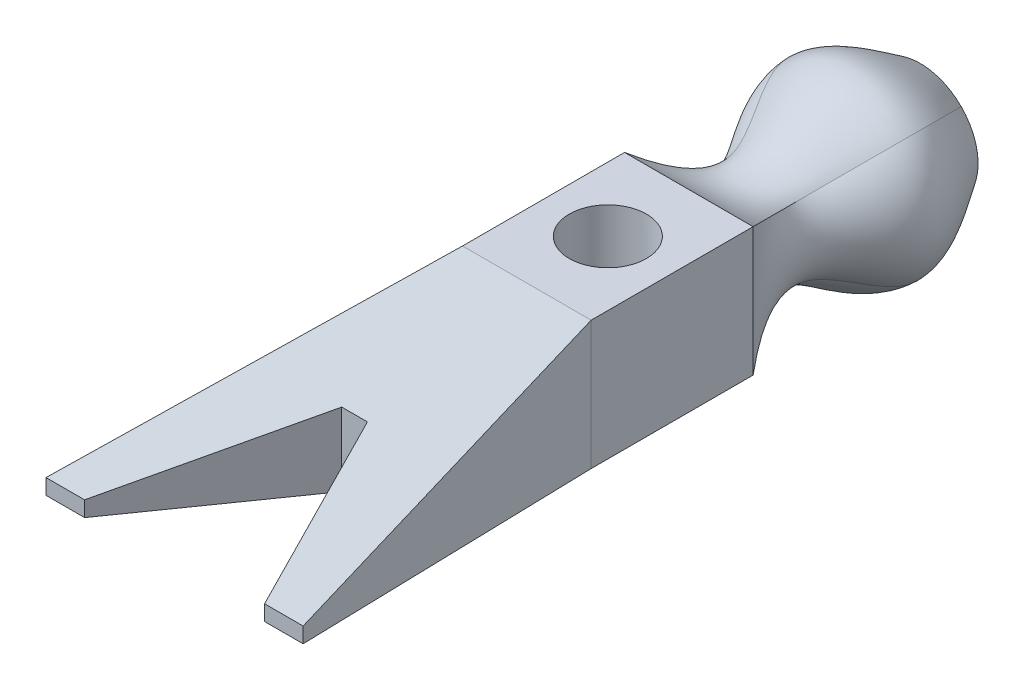
ISO-10303-21;
HEADER;
FILE_DESCRIPTION(('STEP AP214'),'2;1');
FILE_NAME('part.step','',(''),(''),'','','');
FILE_SCHEMA(('AUTOMOTIVE_DESIGN { 1 0 10303 214 1 1 1 1 }'));
ENDSEC;
DATA;
#1=APPLICATION_CONTEXT('core data for automotive mechanical design processes');
#2=APPLICATION_PROTOCOL_DEFINITION('international standard','automotive_design',2000,#1);
#3=PRODUCT_CONTEXT('',#1,'mechanical');
#4=PRODUCT('Part','Part','',(#3));
#5=PRODUCT_RELATED_PRODUCT_CATEGORY('part','',(#4));
#6=PRODUCT_DEFINITION_FORMATION('','',#4);
#7=PRODUCT_DEFINITION_CONTEXT('part definition',#1,'design');
#8=PRODUCT_DEFINITION('design','',#6,#7);
#9=PRODUCT_DEFINITION_SHAPE('','',#8);
#10=(LENGTH_UNIT() NAMED_UNIT(*) SI_UNIT(.MILLI.,.METRE.));
#11=(NAMED_UNIT(*) PLANE_ANGLE_UNIT() SI_UNIT($,.RADIAN.));
#12=(NAMED_UNIT(*) SI_UNIT($,.STERADIAN.) SOLID_ANGLE_UNIT());
#13=UNCERTAINTY_MEASURE_WITH_UNIT(LENGTH_MEASURE(1.E-05),#10,'distance_accuracy_value','');
#14=(GEOMETRIC_REPRESENTATION_CONTEXT(3) GLOBAL_UNCERTAINTY_ASSIGNED_CONTEXT((#13)) GLOBAL_UNIT_ASSIGNED_CONTEXT((#10,
#11,#12)) REPRESENTATION_CONTEXT('',''));
#15=CARTESIAN_POINT('',(0.,0.,0.));
#16=DIRECTION('',(0.,0.,1.));
#17=DIRECTION('',(1.,0.,0.));
#18=AXIS2_PLACEMENT_3D('',#15,#16,#17);
#19=CARTESIAN_POINT('',(0.,0.,200.));
#20=DIRECTION('',(0.,0.,1.));
#21=DIRECTION('',(1.,0.,0.));
#22=AXIS2_PLACEMENT_3D('',#19,#20,#21);
#23=PLANE('',#22);
#24=DIRECTION('',(0.,1.,0.));
#25=VECTOR('',#24,1.);
#26=CARTESIAN_POINT('',(-35.,-35.,200.));
#27=LINE('',#26,#25);
#28=CARTESIAN_POINT('',(-35.,-3.,200.));
#29=VERTEX_POINT('',#28);
#30=CARTESIAN_POINT('',(-35.,3.,200.));
#31=VERTEX_POINT('',#30);
#32=EDGE_CURVE('E416',#29,#31,#27,.T.);
#33=ORIENTED_EDGE('',*,*,#32,.T.);
#34=DIRECTION('',(-1.,0.,0.));
#35=VECTOR('',#34,1.);
#36=CARTESIAN_POINT('',(-49.9999999999999,3.,200.));
#37=LINE('',#36,#35);
#38=CARTESIAN_POINT('',(-49.9999999999999,3.,200.));
#39=VERTEX_POINT('',#38);
#40=EDGE_CURVE('E274',#31,#39,#37,.T.);
#41=ORIENTED_EDGE('',*,*,#40,.T.);
#42=DIRECTION('',(0.,-1.,0.));
#43=VECTOR('',#42,1.);
#44=CARTESIAN_POINT('',(-49.9999999999999,3.,200.));
#45=LINE('',#44,#43);
#46=CARTESIAN_POINT('',(-49.9999999999999,-3.,200.));
#47=VERTEX_POINT('',#46);
#48=EDGE_CURVE('E439',#39,#47,#45,.T.);
#49=ORIENTED_EDGE('',*,*,#48,.T.);
#50=DIRECTION('',(1.,0.,0.));
#51=VECTOR('',#50,1.);
#52=CARTESIAN_POINT('',(-49.9999999999999,-3.,200.));
#53=LINE('',#52,#51);
#54=EDGE_CURVE('E250',#47,#29,#53,.T.);
#55=ORIENTED_EDGE('',*,*,#54,.T.);
#56=EDGE_LOOP('',(#33,#41,#49,#55));
#57=FACE_BOUND('',#56,.T.);
#58=ADVANCED_FACE('F72',(#57),#23,.T.);
#59=CARTESIAN_POINT('',(25.,25.,63.));
#60=DIRECTION('',(-1.,0.,0.));
#61=DIRECTION('',(0.,-1.,0.));
#62=AXIS2_PLACEMENT_3D('',#59,#60,#61);
#63=PLANE('',#62);
#64=DIRECTION('',(0.,-1.,0.));
#65=VECTOR('',#64,1.);
#66=CARTESIAN_POINT('',(25.,25.,0.));
#67=LINE('',#66,#65);
#68=CARTESIAN_POINT('',(25.,-25.,0.));
#69=VERTEX_POINT('',#68);
#70=CARTESIAN_POINT('',(25.,25.,0.));
#71=VERTEX_POINT('',#70);
#72=EDGE_CURVE('E176',#69,#71,#67,.F.);
#73=ORIENTED_EDGE('',*,*,#72,.T.);
#74=DIRECTION('',(0.,0.,-1.));
#75=VECTOR('',#74,1.);
#76=CARTESIAN_POINT('',(25.,25.,63.));
#77=LINE('',#76,#75);
#78=CARTESIAN_POINT('',(25.,25.,63.));
#79=VERTEX_POINT('',#78);
#80=EDGE_CURVE('E166',#79,#71,#77,.T.);
#81=ORIENTED_EDGE('',*,*,#80,.F.);
#82=DIRECTION('',(0.,1.,0.));
#83=VECTOR('',#82,1.);
#84=CARTESIAN_POINT('',(25.,0.,63.));
#85=LINE('',#84,#83);
#86=CARTESIAN_POINT('',(25.,-25.,63.));
#87=VERTEX_POINT('',#86);
#88=EDGE_CURVE('E112',#87,#79,#85,.T.);
#89=ORIENTED_EDGE('',*,*,#88,.F.);
#90=DIRECTION('',(0.,0.,-1.));
#91=VECTOR('',#90,1.);
#92=CARTESIAN_POINT('',(25.,-25.,63.));
#93=LINE('',#92,#91);
#94=EDGE_CURVE('E383',#87,#69,#93,.T.);
#95=ORIENTED_EDGE('',*,*,#94,.T.);
#96=EDGE_LOOP('',(#73,#81,#89,#95));
#97=FACE_BOUND('',#96,.T.);
#98=ADVANCED_FACE('F74',(#97),#63,.F.);
#99=CARTESIAN_POINT('',(-25.,25.,63.));
#100=DIRECTION('',(0.,-1.,0.));
#101=DIRECTION('',(0.,0.,-1.));
#102=AXIS2_PLACEMENT_3D('',#99,#100,#101);
#103=PLANE('',#102);
#104=CARTESIAN_POINT('',(0.,25.,31.5));
#105=DIRECTION('',(0.,-1.,0.));
#106=DIRECTION('',(0.,0.,-1.));
#107=AXIS2_PLACEMENT_3D('',#104,#105,#106);
#108=CIRCLE('',#107,15.);
#109=CARTESIAN_POINT('',(0.,25.,16.5));
#110=VERTEX_POINT('',#109);
#111=EDGE_CURVE('E428',#110,#110,#108,.T.);
#112=ORIENTED_EDGE('',*,*,#111,.T.);
#113=EDGE_LOOP('',(#112));
#114=FACE_BOUND('',#113,.T.);
#115=DIRECTION('',(1.,0.,0.));
#116=VECTOR('',#115,1.);
#117=CARTESIAN_POINT('',(-25.,25.,0.));
#118=LINE('',#117,#116);
#119=CARTESIAN_POINT('',(-25.,25.,0.));
#120=VERTEX_POINT('',#119);
#121=EDGE_CURVE('E377',#71,#120,#118,.F.);
#122=ORIENTED_EDGE('',*,*,#121,.T.);
#123=DIRECTION('',(0.,0.,-1.));
#124=VECTOR('',#123,1.);
#125=CARTESIAN_POINT('',(-25.,25.,63.));
#126=LINE('',#125,#124);
#127=CARTESIAN_POINT('',(-25.,25.,63.));
#128=VERTEX_POINT('',#127);
#129=EDGE_CURVE('E169',#128,#120,#126,.T.);
#130=ORIENTED_EDGE('',*,*,#129,.F.);
#131=DIRECTION('',(1.,0.,0.));
#132=VECTOR('',#131,1.);
#133=CARTESIAN_POINT('',(0.,25.,63.));
#134=LINE('',#133,#132);
#135=EDGE_CURVE('E163',#79,#128,#134,.F.);
#136=ORIENTED_EDGE('',*,*,#135,.F.);
#137=ORIENTED_EDGE('',*,*,#80,.T.);
#138=EDGE_LOOP('',(#122,#130,#136,#137));
#139=FACE_BOUND('',#138,.T.);
#140=ADVANCED_FACE('F165',(#114,#139),#103,.F.);
#141=CARTESIAN_POINT('',(-25.,25.,63.));
#142=DIRECTION('',(1.,0.,0.));
#143=DIRECTION('',(0.,1.,0.));
#144=AXIS2_PLACEMENT_3D('',#141,#142,#143);
#145=PLANE('',#144);
#146=DIRECTION('',(0.,1.,0.));
#147=VECTOR('',#146,1.);
#148=CARTESIAN_POINT('',(-25.,25.,0.));
#149=LINE('',#148,#147);
#150=CARTESIAN_POINT('',(-25.,-25.,0.));
#151=VERTEX_POINT('',#150);
#152=EDGE_CURVE('E380',#120,#151,#149,.F.);
#153=ORIENTED_EDGE('',*,*,#152,.T.);
#154=DIRECTION('',(0.,0.,-1.));
#155=VECTOR('',#154,1.);
#156=CARTESIAN_POINT('',(-25.,-25.,63.));
#157=LINE('',#156,#155);
#158=CARTESIAN_POINT('',(-25.,-25.,63.));
#159=VERTEX_POINT('',#158);
#160=EDGE_CURVE('E98',#159,#151,#157,.T.);
#161=ORIENTED_EDGE('',*,*,#160,.F.);
#162=DIRECTION('',(0.,1.,0.));
#163=VECTOR('',#162,1.);
#164=CARTESIAN_POINT('',(-25.,0.,63.));
#165=LINE('',#164,#163);
#166=EDGE_CURVE('E174',#128,#159,#165,.F.);
#167=ORIENTED_EDGE('',*,*,#166,.F.);
#168=ORIENTED_EDGE('',*,*,#129,.T.);
#169=EDGE_LOOP('',(#153,#161,#167,#168));
#170=FACE_BOUND('',#169,.T.);
#171=ADVANCED_FACE('F456',(#170),#145,.F.);
#172=CARTESIAN_POINT('',(-25.,-25.,63.));
#173=DIRECTION('',(0.,1.,0.));
#174=DIRECTION('',(0.,0.,1.));
#175=AXIS2_PLACEMENT_3D('',#172,#173,#174);
#176=PLANE('',#175);
#177=CARTESIAN_POINT('',(0.,-25.,31.5));
#178=DIRECTION('',(0.,1.,0.));
#179=DIRECTION('',(0.,0.,1.));
#180=AXIS2_PLACEMENT_3D('',#177,#178,#179);
#181=CIRCLE('',#180,15.);
#182=CARTESIAN_POINT('',(0.,-25.,46.5));
#183=VERTEX_POINT('',#182);
#184=EDGE_CURVE('E76',#183,#183,#181,.T.);
#185=ORIENTED_EDGE('',*,*,#184,.T.);
#186=EDGE_LOOP('',(#185));
#187=FACE_BOUND('',#186,.T.);
#188=DIRECTION('',(1.,0.,0.));
#189=VECTOR('',#188,1.);
#190=CARTESIAN_POINT('',(-25.,-25.,0.));
#191=LINE('',#190,#189);
#192=EDGE_CURVE('E187',#151,#69,#191,.T.);
#193=ORIENTED_EDGE('',*,*,#192,.T.);
#194=ORIENTED_EDGE('',*,*,#94,.F.);
#195=DIRECTION('',(1.,0.,0.));
#196=VECTOR('',#195,1.);
#197=CARTESIAN_POINT('',(0.,-25.,63.));
#198=LINE('',#197,#196);
#199=EDGE_CURVE('E385',#159,#87,#198,.T.);
#200=ORIENTED_EDGE('',*,*,#199,.F.);
#201=ORIENTED_EDGE('',*,*,#160,.T.);
#202=EDGE_LOOP('',(#193,#194,#200,#201));
#203=FACE_BOUND('',#202,.T.);
#204=ADVANCED_FACE('F441',(#187,#203),#176,.F.);
#205=CARTESIAN_POINT('',(0.,0.,-90.));
#206=DIRECTION('',(0.,0.,1.));
#207=DIRECTION('',(1.,0.,0.));
#208=AXIS2_PLACEMENT_3D('',#205,#206,#207);
#209=PLANE('',#208);
#210=CARTESIAN_POINT('',(0.,0.,-90.));
#211=DIRECTION('',(0.,0.,1.));
#212=DIRECTION('',(1.,0.,0.));
#213=AXIS2_PLACEMENT_3D('',#210,#211,#212);
#214=CIRCLE('',#213,22.5);
#215=CARTESIAN_POINT('',(15.9099025766973,-15.9099025766973,-90.));
#216=VERTEX_POINT('',#215);
#217=CARTESIAN_POINT('',(15.9099025766973,15.9099025766973,-90.));
#218=VERTEX_POINT('',#217);
#219=EDGE_CURVE('E339',#216,#218,#214,.T.);
#220=ORIENTED_EDGE('',*,*,#219,.F.);
#221=CARTESIAN_POINT('',(-15.9099025766973,-15.9099025766973,-90.));
#222=VERTEX_POINT('',#221);
#223=EDGE_CURVE('E344',#222,#216,#214,.T.);
#224=ORIENTED_EDGE('',*,*,#223,.F.);
#225=CARTESIAN_POINT('',(-15.9099025766973,15.9099025766973,-90.));
#226=VERTEX_POINT('',#225);
#227=EDGE_CURVE('E350',#226,#222,#214,.T.);
#228=ORIENTED_EDGE('',*,*,#227,.F.);
#229=EDGE_CURVE('E347',#218,#226,#214,.T.);
#230=ORIENTED_EDGE('',*,*,#229,.F.);
#231=EDGE_LOOP('',(#220,#224,#228,#230));
#232=FACE_BOUND('',#231,.T.);
#233=ADVANCED_FACE('F233',(#232),#209,.F.);
#234=CARTESIAN_POINT('',(25.,25.,0.));
#235=CARTESIAN_POINT('',(17.8034263280629,17.8034263280629,-9.97003872411579));
#236=CARTESIAN_POINT('',(7.92921021509833,7.92921021509832,-30.94737581867));
#237=CARTESIAN_POINT('',(30.6685109696872,30.6685109696872,-59.3557953194441));
#238=CARTESIAN_POINT('',(22.0914700904497,22.0914700904497,-79.8093587521664));
#239=CARTESIAN_POINT('',(15.9099025766973,15.9099025766973,-90.));
#240=CARTESIAN_POINT('',(25.,8.33333333333334,0.));
#241=CARTESIAN_POINT('',(17.8034263280629,5.93447544268765,-9.97003872411579));
#242=CARTESIAN_POINT('',(16.6623393935978,4.45882254041383,-30.94737581867));
#243=CARTESIAN_POINT('',(47.8879841686818,13.80303148055,-59.3557953194441));
#244=CARTESIAN_POINT('',(30.8723841289432,9.189511042788,-79.8093587521664));
#245=CARTESIAN_POINT('',(24.6908166151908,7.12898853820386,-90.));
#246=CARTESIAN_POINT('',(25.,-8.33333333333333,0.));
#247=CARTESIAN_POINT('',(17.8034263280629,-5.93447544268764,-9.97003872411579));
#248=CARTESIAN_POINT('',(16.6623393935978,-4.45882254041384,-30.94737581867));
#249=CARTESIAN_POINT('',(47.8879841686818,-13.80303148055,-59.3557953194441));
#250=CARTESIAN_POINT('',(30.8723841289432,-9.18951104278801,-79.8093587521664));
#251=CARTESIAN_POINT('',(24.6908166151908,-7.12898853820387,-90.));
#252=CARTESIAN_POINT('',(25.,-25.,0.));
#253=CARTESIAN_POINT('',(17.8034263280629,-17.8034263280629,-9.97003872411579));
#254=CARTESIAN_POINT('',(7.92921021509832,-7.92921021509833,-30.94737581867));
#255=CARTESIAN_POINT('',(30.6685109696872,-30.6685109696872,-59.3557953194441));
#256=CARTESIAN_POINT('',(22.0914700904497,-22.0914700904497,-79.8093587521664));
#257=CARTESIAN_POINT('',(15.9099025766973,-15.9099025766973,-90.));
#258=B_SPLINE_SURFACE_WITH_KNOTS('',3,3,((#234,#235,#236,#237,#238,#239),(#240,#241,#242,#243,
#244,#245),(#246,#247,#248,#249,#250,#251),(#252,#253,#254,#255,#256,#257)),.UNSPECIFIED.,.F.,
.F.,.F.,(4,4),(4,1,1,4),(0.,1.),(0.,0.326789660594509,0.668700814395463,1.),.UNSPECIFIED.);
#259=CARTESIAN_POINT('',(25.,-25.,0.));
#260=CARTESIAN_POINT('',(17.8034263280629,-17.8034263280629,-9.97003872411579));
#261=CARTESIAN_POINT('',(7.92921021509832,-7.92921021509833,-30.94737581867));
#262=CARTESIAN_POINT('',(30.6685109696872,-30.6685109696872,-59.3557953194441));
#263=CARTESIAN_POINT('',(22.0914700904497,-22.0914700904497,-79.8093587521664));
#264=CARTESIAN_POINT('',(15.9099025766973,-15.9099025766973,-90.));
#265=B_SPLINE_CURVE_WITH_KNOTS('',3,(#259,#260,#261,#262,#263,#264),.UNSPECIFIED.,.F.,.F.,(4,1,
1,4),(0.,0.326789660594509,0.668700814395463,1.),.UNSPECIFIED.);
#266=EDGE_CURVE('E449',#69,#216,#265,.T.);
#267=CARTESIAN_POINT('',(25.,25.,0.));
#268=CARTESIAN_POINT('',(17.8034263280629,17.8034263280629,-9.97003872411579));
#269=CARTESIAN_POINT('',(7.92921021509833,7.92921021509832,-30.94737581867));
#270=CARTESIAN_POINT('',(30.6685109696872,30.6685109696872,-59.3557953194441));
#271=CARTESIAN_POINT('',(22.0914700904497,22.0914700904497,-79.8093587521664));
#272=CARTESIAN_POINT('',(15.9099025766973,15.9099025766973,-90.));
#273=B_SPLINE_CURVE_WITH_KNOTS('',3,(#267,#268,#269,#270,#271,#272),.UNSPECIFIED.,.F.,.F.,(4,1,
1,4),(0.,0.326789660594509,0.668700814395463,1.),.UNSPECIFIED.);
#274=EDGE_CURVE('E454',#218,#71,#273,.F.);
#275=ORIENTED_EDGE('',*,*,#72,.F.);
#276=ORIENTED_EDGE('',*,*,#266,.T.);
#277=ORIENTED_EDGE('',*,*,#219,.T.);
#278=ORIENTED_EDGE('',*,*,#274,.T.);
#279=EDGE_LOOP('',(#275,#276,#277,#278));
#280=FACE_BOUND('',#279,.T.);
#281=ADVANCED_FACE('F532',(#280),#258,.T.);
#282=CARTESIAN_POINT('',(25.,-25.,0.));
#283=CARTESIAN_POINT('',(17.8034263280629,-17.8034263280629,-9.97003872411579));
#284=CARTESIAN_POINT('',(7.92921021509832,-7.92921021509833,-30.94737581867));
#285=CARTESIAN_POINT('',(30.6685109696872,-30.6685109696872,-59.3557953194441));
#286=CARTESIAN_POINT('',(22.0914700904497,-22.0914700904497,-79.8093587521664));
#287=CARTESIAN_POINT('',(15.9099025766973,-15.9099025766973,-90.));
#288=CARTESIAN_POINT('',(8.33333333333333,-25.,0.));
#289=CARTESIAN_POINT('',(5.93447544268765,-17.8034263280629,-9.97003872411579));
#290=CARTESIAN_POINT('',(4.45882254041384,-16.6623393935978,-30.94737581867));
#291=CARTESIAN_POINT('',(13.80303148055,-47.8879841686818,-59.3557953194441));
#292=CARTESIAN_POINT('',(9.189511042788,-30.8723841289432,-79.8093587521664));
#293=CARTESIAN_POINT('',(7.12898853820386,-24.6908166151908,-90.));
#294=CARTESIAN_POINT('',(-8.33333333333333,-25.,0.));
#295=CARTESIAN_POINT('',(-5.93447544268765,-17.8034263280629,-9.97003872411579));
#296=CARTESIAN_POINT('',(-4.45882254041384,-16.6623393935978,-30.94737581867));
#297=CARTESIAN_POINT('',(-13.80303148055,-47.8879841686818,-59.3557953194441));
#298=CARTESIAN_POINT('',(-9.18951104278801,-30.8723841289432,-79.8093587521664));
#299=CARTESIAN_POINT('',(-7.12898853820387,-24.6908166151908,-90.));
#300=CARTESIAN_POINT('',(-25.,-25.,0.));
#301=CARTESIAN_POINT('',(-17.8034263280629,-17.8034263280629,-9.97003872411579));
#302=CARTESIAN_POINT('',(-7.92921021509833,-7.92921021509833,-30.94737581867));
#303=CARTESIAN_POINT('',(-30.6685109696872,-30.6685109696872,-59.3557953194441));
#304=CARTESIAN_POINT('',(-22.0914700904497,-22.0914700904497,-79.8093587521664));
#305=CARTESIAN_POINT('',(-15.9099025766973,-15.9099025766973,-90.));
#306=B_SPLINE_SURFACE_WITH_KNOTS('',3,3,((#282,#283,#284,#285,#286,#287),(#288,#289,#290,#291,
#292,#293),(#294,#295,#296,#297,#298,#299),(#300,#301,#302,#303,#304,#305)),.UNSPECIFIED.,.F.,
.F.,.F.,(4,4),(4,1,1,4),(0.,1.),(0.,0.326789660594509,0.668700814395463,1.),.UNSPECIFIED.);
#307=CARTESIAN_POINT('',(-25.,-25.,0.));
#308=CARTESIAN_POINT('',(-17.8034263280629,-17.8034263280629,-9.97003872411579));
#309=CARTESIAN_POINT('',(-7.92921021509833,-7.92921021509833,-30.94737581867));
#310=CARTESIAN_POINT('',(-30.6685109696872,-30.6685109696872,-59.3557953194441));
#311=CARTESIAN_POINT('',(-22.0914700904497,-22.0914700904497,-79.8093587521664));
#312=CARTESIAN_POINT('',(-15.9099025766973,-15.9099025766973,-90.));
#313=B_SPLINE_CURVE_WITH_KNOTS('',3,(#307,#308,#309,#310,#311,#312),.UNSPECIFIED.,.F.,.F.,(4,1,
1,4),(0.,0.326789660594509,0.668700814395463,1.),.UNSPECIFIED.);
#314=EDGE_CURVE('E447',#151,#222,#313,.T.);
#315=ORIENTED_EDGE('',*,*,#192,.F.);
#316=ORIENTED_EDGE('',*,*,#314,.T.);
#317=ORIENTED_EDGE('',*,*,#223,.T.);
#318=ORIENTED_EDGE('',*,*,#266,.F.);
#319=EDGE_LOOP('',(#315,#316,#317,#318));
#320=FACE_BOUND('',#319,.T.);
#321=ADVANCED_FACE('F446',(#320),#306,.T.);
#322=CARTESIAN_POINT('',(-25.,25.,0.));
#323=CARTESIAN_POINT('',(-17.8034263280629,17.8034263280629,-9.97003872411579));
#324=CARTESIAN_POINT('',(-7.92921021509833,7.92921021509832,-30.94737581867));
#325=CARTESIAN_POINT('',(-30.6685109696872,30.6685109696872,-59.3557953194441));
#326=CARTESIAN_POINT('',(-22.0914700904497,22.0914700904497,-79.8093587521664));
#327=CARTESIAN_POINT('',(-15.9099025766973,15.9099025766973,-90.));
#328=CARTESIAN_POINT('',(-8.33333333333334,25.,0.));
#329=CARTESIAN_POINT('',(-5.93447544268765,17.8034263280629,-9.97003872411579));
#330=CARTESIAN_POINT('',(-4.45882254041384,16.6623393935978,-30.94737581867));
#331=CARTESIAN_POINT('',(-13.80303148055,47.8879841686818,-59.3557953194441));
#332=CARTESIAN_POINT('',(-9.189511042788,30.8723841289432,-79.8093587521664));
#333=CARTESIAN_POINT('',(-7.12898853820386,24.6908166151908,-90.));
#334=CARTESIAN_POINT('',(8.33333333333333,25.,0.));
#335=CARTESIAN_POINT('',(5.93447544268764,17.8034263280629,-9.97003872411579));
#336=CARTESIAN_POINT('',(4.45882254041384,16.6623393935978,-30.94737581867));
#337=CARTESIAN_POINT('',(13.80303148055,47.8879841686818,-59.3557953194441));
#338=CARTESIAN_POINT('',(9.189511042788,30.8723841289432,-79.8093587521664));
#339=CARTESIAN_POINT('',(7.12898853820386,24.6908166151908,-90.));
#340=CARTESIAN_POINT('',(25.,25.,0.));
#341=CARTESIAN_POINT('',(17.8034263280629,17.8034263280629,-9.97003872411579));
#342=CARTESIAN_POINT('',(7.92921021509832,7.92921021509833,-30.94737581867));
#343=CARTESIAN_POINT('',(30.6685109696872,30.6685109696872,-59.3557953194441));
#344=CARTESIAN_POINT('',(22.0914700904497,22.0914700904497,-79.8093587521664));
#345=CARTESIAN_POINT('',(15.9099025766973,15.9099025766973,-90.));
#346=B_SPLINE_SURFACE_WITH_KNOTS('',3,3,((#322,#323,#324,#325,#326,#327),(#328,#329,#330,#331,
#332,#333),(#334,#335,#336,#337,#338,#339),(#340,#341,#342,#343,#344,#345)),.UNSPECIFIED.,.F.,
.F.,.F.,(4,4),(4,1,1,4),(0.,1.),(0.,0.326789660594509,0.668700814395463,1.),.UNSPECIFIED.);
#347=CARTESIAN_POINT('',(-25.,25.,0.));
#348=CARTESIAN_POINT('',(-17.8034263280629,17.8034263280629,-9.97003872411579));
#349=CARTESIAN_POINT('',(-7.92921021509832,7.92921021509833,-30.94737581867));
#350=CARTESIAN_POINT('',(-30.6685109696872,30.6685109696872,-59.3557953194441));
#351=CARTESIAN_POINT('',(-22.0914700904497,22.0914700904497,-79.8093587521664));
#352=CARTESIAN_POINT('',(-15.9099025766973,15.9099025766973,-90.));
#353=B_SPLINE_CURVE_WITH_KNOTS('',3,(#347,#348,#349,#350,#351,#352),.UNSPECIFIED.,.F.,.F.,(4,1,
1,4),(0.,0.326789660594509,0.668700814395463,1.),.UNSPECIFIED.);
#354=EDGE_CURVE('E273',#120,#226,#353,.T.);
#355=ORIENTED_EDGE('',*,*,#121,.F.);
#356=ORIENTED_EDGE('',*,*,#274,.F.);
#357=ORIENTED_EDGE('',*,*,#229,.T.);
#358=ORIENTED_EDGE('',*,*,#354,.F.);
#359=EDGE_LOOP('',(#355,#356,#357,#358));
#360=FACE_BOUND('',#359,.T.);
#361=ADVANCED_FACE('F517',(#360),#346,.T.);
#362=CARTESIAN_POINT('',(-25.,-25.,0.));
#363=CARTESIAN_POINT('',(-17.8034263280629,-17.8034263280629,-9.97003872411579));
#364=CARTESIAN_POINT('',(-7.92921021509833,-7.92921021509832,-30.94737581867));
#365=CARTESIAN_POINT('',(-30.6685109696872,-30.6685109696872,-59.3557953194441));
#366=CARTESIAN_POINT('',(-22.0914700904497,-22.0914700904497,-79.8093587521664));
#367=CARTESIAN_POINT('',(-15.9099025766973,-15.9099025766973,-90.));
#368=CARTESIAN_POINT('',(-25.,-8.33333333333333,0.));
#369=CARTESIAN_POINT('',(-17.8034263280629,-5.93447544268764,-9.97003872411579));
#370=CARTESIAN_POINT('',(-16.6623393935978,-4.45882254041384,-30.94737581867));
#371=CARTESIAN_POINT('',(-47.8879841686818,-13.80303148055,-59.3557953194441));
#372=CARTESIAN_POINT('',(-30.8723841289432,-9.189511042788,-79.8093587521664));
#373=CARTESIAN_POINT('',(-24.6908166151908,-7.12898853820386,-90.));
#374=CARTESIAN_POINT('',(-25.,8.33333333333334,0.));
#375=CARTESIAN_POINT('',(-17.8034263280629,5.93447544268765,-9.97003872411579));
#376=CARTESIAN_POINT('',(-16.6623393935978,4.45882254041384,-30.94737581867));
#377=CARTESIAN_POINT('',(-47.8879841686818,13.80303148055,-59.3557953194441));
#378=CARTESIAN_POINT('',(-30.8723841289432,9.189511042788,-79.8093587521664));
#379=CARTESIAN_POINT('',(-24.6908166151908,7.12898853820386,-90.));
#380=CARTESIAN_POINT('',(-25.,25.,0.));
#381=CARTESIAN_POINT('',(-17.8034263280629,17.8034263280629,-9.97003872411579));
#382=CARTESIAN_POINT('',(-7.92921021509832,7.92921021509833,-30.94737581867));
#383=CARTESIAN_POINT('',(-30.6685109696872,30.6685109696872,-59.3557953194441));
#384=CARTESIAN_POINT('',(-22.0914700904497,22.0914700904497,-79.8093587521664));
#385=CARTESIAN_POINT('',(-15.9099025766973,15.9099025766973,-90.));
#386=B_SPLINE_SURFACE_WITH_KNOTS('',3,3,((#362,#363,#364,#365,#366,#367),(#368,#369,#370,#371,
#372,#373),(#374,#375,#376,#377,#378,#379),(#380,#381,#382,#383,#384,#385)),.UNSPECIFIED.,.F.,
.F.,.F.,(4,4),(4,1,1,4),(0.,1.),(0.,0.326789660594509,0.668700814395463,1.),.UNSPECIFIED.);
#387=ORIENTED_EDGE('',*,*,#152,.F.);
#388=ORIENTED_EDGE('',*,*,#354,.T.);
#389=ORIENTED_EDGE('',*,*,#227,.T.);
#390=ORIENTED_EDGE('',*,*,#314,.F.);
#391=EDGE_LOOP('',(#387,#388,#389,#390));
#392=FACE_BOUND('',#391,.T.);
#393=ADVANCED_FACE('F302',(#392),#386,.T.);
#394=DIRECTION('',(0.,1.,0.));
#395=VECTOR('',#394,1.);
#396=CARTESIAN_POINT('',(35.,-35.,200.));
#397=LINE('',#396,#395);
#398=CARTESIAN_POINT('',(35.,-3.,200.));
#399=VERTEX_POINT('',#398);
#400=CARTESIAN_POINT('',(35.,3.,200.));
#401=VERTEX_POINT('',#400);
#402=EDGE_CURVE('E89',#399,#401,#397,.T.);
#403=ORIENTED_EDGE('',*,*,#402,.F.);
#404=CARTESIAN_POINT('',(50.0000000000001,-3.,200.));
#405=VERTEX_POINT('',#404);
#406=EDGE_CURVE('E268',#399,#405,#53,.T.);
#407=ORIENTED_EDGE('',*,*,#406,.T.);
#408=DIRECTION('',(0.,1.,0.));
#409=VECTOR('',#408,1.);
#410=CARTESIAN_POINT('',(50.0000000000001,3.,200.));
#411=LINE('',#410,#409);
#412=CARTESIAN_POINT('',(50.0000000000001,3.,200.));
#413=VERTEX_POINT('',#412);
#414=EDGE_CURVE('E197',#405,#413,#411,.T.);
#415=ORIENTED_EDGE('',*,*,#414,.T.);
#416=EDGE_CURVE('E192',#413,#401,#37,.T.);
#417=ORIENTED_EDGE('',*,*,#416,.T.);
#418=EDGE_LOOP('',(#403,#407,#415,#417));
#419=FACE_BOUND('',#418,.T.);
#420=ADVANCED_FACE('F293',(#419),#23,.T.);
#421=CARTESIAN_POINT('',(13.0684747860162,0.,-2.38475817263071));
#422=DIRECTION('',(-0.983754816103938,0.,0.179517302208749));
#423=DIRECTION('',(0.179517302208749,0.,0.983754816103938));
#424=AXIS2_PLACEMENT_3D('',#421,#422,#423);
#425=PLANE('',#424);
#426=DIRECTION('',(0.177318343521448,-0.156040142298874,0.971704522497532));
#427=VECTOR('',#426,1.);
#428=CARTESIAN_POINT('',(25.,25.,63.));
#429=LINE('',#428,#427);
#430=EDGE_CURVE('E183',#79,#413,#429,.T.);
#431=ORIENTED_EDGE('',*,*,#430,.T.);
#432=ORIENTED_EDGE('',*,*,#414,.F.);
#433=DIRECTION('',(0.177318343521448,0.156040142298874,0.971704522497532));
#434=VECTOR('',#433,1.);
#435=CARTESIAN_POINT('',(25.,-25.,63.));
#436=LINE('',#435,#434);
#437=EDGE_CURVE('E186',#87,#405,#436,.T.);
#438=ORIENTED_EDGE('',*,*,#437,.F.);
#439=ORIENTED_EDGE('',*,*,#88,.T.);
#440=EDGE_LOOP('',(#431,#432,#438,#439));
#441=FACE_BOUND('',#440,.T.);
#442=ADVANCED_FACE('F181',(#441),#425,.F.);
#443=CARTESIAN_POINT('',(0.,-34.2339895081286,5.49742897210824));
#444=DIRECTION('',(0.,0.987350525707021,-0.158552639164631));
#445=DIRECTION('',(0.,0.158552639164631,0.987350525707021));
#446=AXIS2_PLACEMENT_3D('',#443,#444,#445);
#447=PLANE('',#446);
#448=DIRECTION('',(-1.,0.,0.));
#449=VECTOR('',#448,1.);
#450=CARTESIAN_POINT('',(0.,-14.2408759124088,130.));
#451=LINE('',#450,#449);
#452=CARTESIAN_POINT('',(5.00000000000001,-14.2408759124088,130.));
#453=VERTEX_POINT('',#452);
#454=CARTESIAN_POINT('',(-5.,-14.2408759124088,130.));
#455=VERTEX_POINT('',#454);
#456=EDGE_CURVE('E430',#453,#455,#451,.T.);
#457=ORIENTED_EDGE('',*,*,#456,.T.);
#458=DIRECTION('',(-0.389697248364067,0.146017947075587,0.909293579516157));
#459=VECTOR('',#458,1.);
#460=CARTESIAN_POINT('',(41.0143708903389,-31.4822703579372,22.6331345892092));
#461=LINE('',#460,#459);
#462=EDGE_CURVE('E415',#455,#29,#461,.T.);
#463=ORIENTED_EDGE('',*,*,#462,.T.);
#464=ORIENTED_EDGE('',*,*,#54,.F.);
#465=DIRECTION('',(-0.177318343521447,0.156040142298874,0.971704522497532));
#466=VECTOR('',#465,1.);
#467=CARTESIAN_POINT('',(-25.,-25.,63.));
#468=LINE('',#467,#466);
#469=EDGE_CURVE('E199',#159,#47,#468,.T.);
#470=ORIENTED_EDGE('',*,*,#469,.F.);
#471=ORIENTED_EDGE('',*,*,#199,.T.);
#472=ORIENTED_EDGE('',*,*,#437,.T.);
#473=ORIENTED_EDGE('',*,*,#406,.F.);
#474=DIRECTION('',(-0.389697248364067,-0.146017947075587,-0.909293579516157));
#475=VECTOR('',#474,1.);
#476=CARTESIAN_POINT('',(-41.0143708903389,-31.4822703579372,22.6331345892092));
#477=LINE('',#476,#475);
#478=EDGE_CURVE('E418',#399,#453,#477,.T.);
#479=ORIENTED_EDGE('',*,*,#478,.T.);
#480=EDGE_LOOP('',(#457,#463,#464,#470,#471,#472,#473,#479));
#481=FACE_BOUND('',#480,.T.);
#482=ADVANCED_FACE('F225',(#481),#447,.F.);
#483=CARTESIAN_POINT('',(0.,34.2339895081286,5.49742897210824));
#484=DIRECTION('',(0.,-0.987350525707021,-0.158552639164631));
#485=DIRECTION('',(0.,0.158552639164631,-0.987350525707021));
#486=AXIS2_PLACEMENT_3D('',#483,#484,#485);
#487=PLANE('',#486);
#488=ORIENTED_EDGE('',*,*,#40,.F.);
#489=DIRECTION('',(0.389697248364067,0.146017947075587,-0.909293579516157));
#490=VECTOR('',#489,1.);
#491=CARTESIAN_POINT('',(41.0143708903389,31.4822703579372,22.6331345892092));
#492=LINE('',#491,#490);
#493=CARTESIAN_POINT('',(-5.,14.2408759124088,130.));
#494=VERTEX_POINT('',#493);
#495=EDGE_CURVE('E12',#31,#494,#492,.T.);
#496=ORIENTED_EDGE('',*,*,#495,.T.);
#497=DIRECTION('',(1.,0.,0.));
#498=VECTOR('',#497,1.);
#499=CARTESIAN_POINT('',(0.,14.2408759124088,130.));
#500=LINE('',#499,#498);
#501=CARTESIAN_POINT('',(5.00000000000001,14.2408759124088,130.));
#502=VERTEX_POINT('',#501);
#503=EDGE_CURVE('E81',#494,#502,#500,.T.);
#504=ORIENTED_EDGE('',*,*,#503,.T.);
#505=DIRECTION('',(0.389697248364067,-0.146017947075587,0.909293579516157));
#506=VECTOR('',#505,1.);
#507=CARTESIAN_POINT('',(-41.0143708903389,31.4822703579372,22.6331345892092));
#508=LINE('',#507,#506);
#509=EDGE_CURVE('E177',#502,#401,#508,.T.);
#510=ORIENTED_EDGE('',*,*,#509,.T.);
#511=ORIENTED_EDGE('',*,*,#416,.F.);
#512=ORIENTED_EDGE('',*,*,#430,.F.);
#513=ORIENTED_EDGE('',*,*,#135,.T.);
#514=DIRECTION('',(-0.177318343521447,-0.156040142298874,0.971704522497532));
#515=VECTOR('',#514,1.);
#516=CARTESIAN_POINT('',(-25.,25.,63.));
#517=LINE('',#516,#515);
#518=EDGE_CURVE('E195',#128,#39,#517,.T.);
#519=ORIENTED_EDGE('',*,*,#518,.T.);
#520=EDGE_LOOP('',(#488,#496,#504,#510,#511,#512,#513,#519));
#521=FACE_BOUND('',#520,.T.);
#522=ADVANCED_FACE('F190',(#521),#487,.F.);
#523=CARTESIAN_POINT('',(-13.0684747860163,0.,-2.38475817263071));
#524=DIRECTION('',(0.983754816103938,0.,0.179517302208747));
#525=DIRECTION('',(0.179517302208747,0.,-0.983754816103938));
#526=AXIS2_PLACEMENT_3D('',#523,#524,#525);
#527=PLANE('',#526);
#528=ORIENTED_EDGE('',*,*,#469,.T.);
#529=ORIENTED_EDGE('',*,*,#48,.F.);
#530=ORIENTED_EDGE('',*,*,#518,.F.);
#531=ORIENTED_EDGE('',*,*,#166,.T.);
#532=EDGE_LOOP('',(#528,#529,#530,#531));
#533=FACE_BOUND('',#532,.T.);
#534=ADVANCED_FACE('F224',(#533),#527,.F.);
#535=CARTESIAN_POINT('',(-5.,-35.,130.));
#536=DIRECTION('',(-0.919145030018058,0.,-0.393919298579168));
#537=DIRECTION('',(-0.393919298579168,0.,0.919145030018058));
#538=AXIS2_PLACEMENT_3D('',#535,#536,#537);
#539=PLANE('',#538);
#540=DIRECTION('',(0.,1.,0.));
#541=VECTOR('',#540,1.);
#542=CARTESIAN_POINT('',(-5.,-35.,130.));
#543=LINE('',#542,#541);
#544=EDGE_CURVE('E410',#455,#494,#543,.T.);
#545=ORIENTED_EDGE('',*,*,#544,.T.);
#546=ORIENTED_EDGE('',*,*,#495,.F.);
#547=ORIENTED_EDGE('',*,*,#32,.F.);
#548=ORIENTED_EDGE('',*,*,#462,.F.);
#549=EDGE_LOOP('',(#545,#546,#547,#548));
#550=FACE_BOUND('',#549,.T.);
#551=ADVANCED_FACE('F231',(#550),#539,.F.);
#552=CARTESIAN_POINT('',(5.,-35.,130.));
#553=DIRECTION('',(0.,0.,-1.));
#554=DIRECTION('',(-1.,0.,0.));
#555=AXIS2_PLACEMENT_3D('',#552,#553,#554);
#556=PLANE('',#555);
#557=DIRECTION('',(0.,1.,0.));
#558=VECTOR('',#557,1.);
#559=CARTESIAN_POINT('',(5.,-35.,130.));
#560=LINE('',#559,#558);
#561=EDGE_CURVE('E413',#453,#502,#560,.T.);
#562=ORIENTED_EDGE('',*,*,#561,.T.);
#563=ORIENTED_EDGE('',*,*,#503,.F.);
#564=ORIENTED_EDGE('',*,*,#544,.F.);
#565=ORIENTED_EDGE('',*,*,#456,.F.);
#566=EDGE_LOOP('',(#562,#563,#564,#565));
#567=FACE_BOUND('',#566,.T.);
#568=ADVANCED_FACE('F408',(#567),#556,.F.);
#569=CARTESIAN_POINT('',(35.,-35.,200.));
#570=DIRECTION('',(0.919145030018058,0.,-0.393919298579168));
#571=DIRECTION('',(-0.393919298579168,0.,-0.919145030018058));
#572=AXIS2_PLACEMENT_3D('',#569,#570,#571);
#573=PLANE('',#572);
#574=ORIENTED_EDGE('',*,*,#402,.T.);
#575=ORIENTED_EDGE('',*,*,#509,.F.);
#576=ORIENTED_EDGE('',*,*,#561,.F.);
#577=ORIENTED_EDGE('',*,*,#478,.F.);
#578=EDGE_LOOP('',(#574,#575,#576,#577));
#579=FACE_BOUND('',#578,.T.);
#580=ADVANCED_FACE('F303',(#579),#573,.F.);
#581=CARTESIAN_POINT('',(0.,-50.,31.5));
#582=DIRECTION('',(0.,1.,0.));
#583=DIRECTION('',(0.,0.,1.));
#584=AXIS2_PLACEMENT_3D('',#581,#582,#583);
#585=CYLINDRICAL_SURFACE('',#584,15.);
#586=ORIENTED_EDGE('',*,*,#184,.F.);
#587=EDGE_LOOP('',(#586));
#588=FACE_BOUND('',#587,.T.);
#589=ORIENTED_EDGE('',*,*,#111,.F.);
#590=EDGE_LOOP('',(#589));
#591=FACE_BOUND('',#590,.T.);
#592=ADVANCED_FACE('F476',(#588,#591),#585,.F.);
#593=CLOSED_SHELL('',(#58,#98,#140,#171,#204,#233,#281,#321,#361,#393,#420,#442,#482,#522,#534,
#551,#568,#580,#592));
#594=MANIFOLD_SOLID_BREP('B2',#593);
#595=ADVANCED_BREP_SHAPE_REPRESENTATION('',(#18,#594),#14);
#596=SHAPE_DEFINITION_REPRESENTATION(#9,#595);
ENDSEC;
END-ISO-10303-21;
